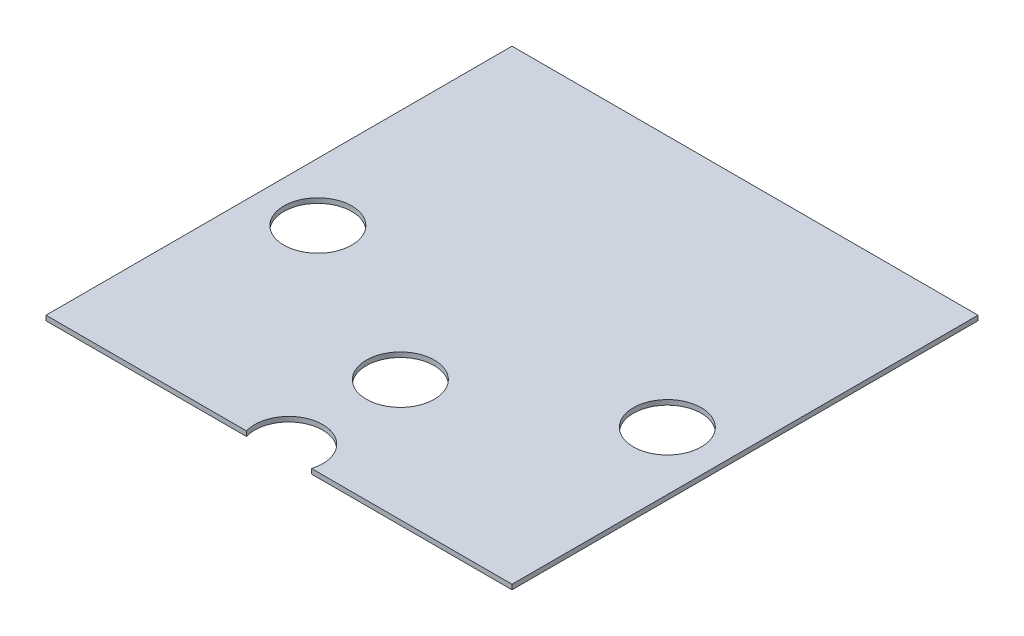
ISO-10303-21;
HEADER;
FILE_DESCRIPTION(('STEP AP214'),'2;1');
FILE_NAME('part.step','',(''),(''),'','','');
FILE_SCHEMA(('AUTOMOTIVE_DESIGN { 1 0 10303 214 1 1 1 1 }'));
ENDSEC;
DATA;
#1=APPLICATION_CONTEXT('core data for automotive mechanical design processes');
#2=APPLICATION_PROTOCOL_DEFINITION('international standard','automotive_design',2000,#1);
#3=PRODUCT_CONTEXT('',#1,'mechanical');
#4=PRODUCT('Part','Part','',(#3));
#5=PRODUCT_RELATED_PRODUCT_CATEGORY('part','',(#4));
#6=PRODUCT_DEFINITION_FORMATION('','',#4);
#7=PRODUCT_DEFINITION_CONTEXT('part definition',#1,'design');
#8=PRODUCT_DEFINITION('design','',#6,#7);
#9=PRODUCT_DEFINITION_SHAPE('','',#8);
#10=(LENGTH_UNIT() NAMED_UNIT(*) SI_UNIT(.MILLI.,.METRE.));
#11=(NAMED_UNIT(*) PLANE_ANGLE_UNIT() SI_UNIT($,.RADIAN.));
#12=(NAMED_UNIT(*) SI_UNIT($,.STERADIAN.) SOLID_ANGLE_UNIT());
#13=UNCERTAINTY_MEASURE_WITH_UNIT(LENGTH_MEASURE(1.E-05),#10,'distance_accuracy_value','');
#14=(GEOMETRIC_REPRESENTATION_CONTEXT(3) GLOBAL_UNCERTAINTY_ASSIGNED_CONTEXT((#13)) GLOBAL_UNIT_ASSIGNED_CONTEXT((#10,
#11,#12)) REPRESENTATION_CONTEXT('',''));
#15=CARTESIAN_POINT('',(0.,0.,0.));
#16=DIRECTION('',(0.,0.,1.));
#17=DIRECTION('',(1.,0.,0.));
#18=AXIS2_PLACEMENT_3D('',#15,#16,#17);
#19=CARTESIAN_POINT('',(-387.157575757576,6.35,327.890909090909));
#20=DIRECTION('',(0.,0.,-1.));
#21=DIRECTION('',(-1.,0.,0.));
#22=AXIS2_PLACEMENT_3D('',#19,#20,#21);
#23=PLANE('',#22);
#24=DIRECTION('',(1.,0.,0.));
#25=VECTOR('',#24,1.);
#26=CARTESIAN_POINT('',(-387.157575757576,0.,327.890909090909));
#27=LINE('',#26,#25);
#28=CARTESIAN_POINT('',(-387.157575757576,0.,327.890909090909));
#29=VERTEX_POINT('',#28);
#30=CARTESIAN_POINT('',(-124.954670728947,0.,327.890909090909));
#31=VERTEX_POINT('',#30);
#32=EDGE_CURVE('E133',#29,#31,#27,.T.);
#33=ORIENTED_EDGE('',*,*,#32,.T.);
#34=DIRECTION('',(0.,1.,0.));
#35=VECTOR('',#34,1.);
#36=CARTESIAN_POINT('',(-124.954670728947,-95.25,327.890909090909));
#37=LINE('',#36,#35);
#38=CARTESIAN_POINT('',(-124.954670728947,6.35,327.890909090909));
#39=VERTEX_POINT('',#38);
#40=EDGE_CURVE('E55',#31,#39,#37,.T.);
#41=ORIENTED_EDGE('',*,*,#40,.T.);
#42=DIRECTION('',(1.,0.,0.));
#43=VECTOR('',#42,1.);
#44=CARTESIAN_POINT('',(-387.157575757576,6.35,327.890909090909));
#45=LINE('',#44,#43);
#46=CARTESIAN_POINT('',(-387.157575757576,6.35,327.890909090909));
#47=VERTEX_POINT('',#46);
#48=EDGE_CURVE('E91',#47,#39,#45,.T.);
#49=ORIENTED_EDGE('',*,*,#48,.F.);
#50=DIRECTION('',(0.,-1.,0.));
#51=VECTOR('',#50,1.);
#52=CARTESIAN_POINT('',(-387.157575757576,6.35,327.890909090909));
#53=LINE('',#52,#51);
#54=EDGE_CURVE('E47',#47,#29,#53,.T.);
#55=ORIENTED_EDGE('',*,*,#54,.T.);
#56=EDGE_LOOP('',(#33,#41,#49,#55));
#57=FACE_BOUND('',#56,.T.);
#58=ADVANCED_FACE('F38',(#57),#23,.F.);
#59=CARTESIAN_POINT('',(-387.157575757576,6.35,-281.709090909091));
#60=DIRECTION('',(1.,0.,0.));
#61=DIRECTION('',(0.,0.,-1.));
#62=AXIS2_PLACEMENT_3D('',#59,#60,#61);
#63=PLANE('',#62);
#64=DIRECTION('',(0.,0.,1.));
#65=VECTOR('',#64,1.);
#66=CARTESIAN_POINT('',(-387.157575757576,0.,-281.709090909091));
#67=LINE('',#66,#65);
#68=CARTESIAN_POINT('',(-387.157575757576,0.,-281.709090909091));
#69=VERTEX_POINT('',#68);
#70=EDGE_CURVE('E129',#69,#29,#67,.T.);
#71=ORIENTED_EDGE('',*,*,#70,.T.);
#72=ORIENTED_EDGE('',*,*,#54,.F.);
#73=DIRECTION('',(0.,0.,1.));
#74=VECTOR('',#73,1.);
#75=CARTESIAN_POINT('',(-387.157575757576,6.35,-281.709090909091));
#76=LINE('',#75,#74);
#77=CARTESIAN_POINT('',(-387.157575757576,6.35,-281.709090909091));
#78=VERTEX_POINT('',#77);
#79=EDGE_CURVE('E120',#78,#47,#76,.T.);
#80=ORIENTED_EDGE('',*,*,#79,.F.);
#81=DIRECTION('',(0.,-1.,0.));
#82=VECTOR('',#81,1.);
#83=CARTESIAN_POINT('',(-387.157575757576,6.35,-281.709090909091));
#84=LINE('',#83,#82);
#85=EDGE_CURVE('E128',#78,#69,#84,.T.);
#86=ORIENTED_EDGE('',*,*,#85,.T.);
#87=EDGE_LOOP('',(#71,#72,#80,#86));
#88=FACE_BOUND('',#87,.T.);
#89=ADVANCED_FACE('F40',(#88),#63,.F.);
#90=CARTESIAN_POINT('',(-39.7604807862044,6.35,327.890909090909));
#91=VERTEX_POINT('',#90);
#92=CARTESIAN_POINT('',(222.442424242424,6.35,327.890909090909));
#93=VERTEX_POINT('',#92);
#94=EDGE_CURVE('E111',#91,#93,#45,.T.);
#95=ORIENTED_EDGE('',*,*,#94,.F.);
#96=DIRECTION('',(0.,1.,0.));
#97=VECTOR('',#96,1.);
#98=CARTESIAN_POINT('',(-39.7604807862044,-95.25,327.890909090909));
#99=LINE('',#98,#97);
#100=CARTESIAN_POINT('',(-39.7604807862044,0.,327.890909090909));
#101=VERTEX_POINT('',#100);
#102=EDGE_CURVE('E100',#91,#101,#99,.F.);
#103=ORIENTED_EDGE('',*,*,#102,.T.);
#104=CARTESIAN_POINT('',(222.442424242424,0.,327.890909090909));
#105=VERTEX_POINT('',#104);
#106=EDGE_CURVE('E132',#101,#105,#27,.T.);
#107=ORIENTED_EDGE('',*,*,#106,.T.);
#108=DIRECTION('',(0.,-1.,0.));
#109=VECTOR('',#108,1.);
#110=CARTESIAN_POINT('',(222.442424242424,6.35,327.890909090909));
#111=LINE('',#110,#109);
#112=EDGE_CURVE('E118',#93,#105,#111,.T.);
#113=ORIENTED_EDGE('',*,*,#112,.F.);
#114=EDGE_LOOP('',(#95,#103,#107,#113));
#115=FACE_BOUND('',#114,.T.);
#116=ADVANCED_FACE('F116',(#115),#23,.F.);
#117=CARTESIAN_POINT('',(222.442424242424,6.35,-281.709090909091));
#118=DIRECTION('',(-1.,0.,0.));
#119=DIRECTION('',(0.,0.,1.));
#120=AXIS2_PLACEMENT_3D('',#117,#118,#119);
#121=PLANE('',#120);
#122=DIRECTION('',(0.,0.,-1.));
#123=VECTOR('',#122,1.);
#124=CARTESIAN_POINT('',(222.442424242424,0.,-281.709090909091));
#125=LINE('',#124,#123);
#126=CARTESIAN_POINT('',(222.442424242424,0.,-281.709090909091));
#127=VERTEX_POINT('',#126);
#128=EDGE_CURVE('E136',#105,#127,#125,.T.);
#129=ORIENTED_EDGE('',*,*,#128,.T.);
#130=DIRECTION('',(0.,-1.,0.));
#131=VECTOR('',#130,1.);
#132=CARTESIAN_POINT('',(222.442424242424,6.35,-281.709090909091));
#133=LINE('',#132,#131);
#134=CARTESIAN_POINT('',(222.442424242424,6.35,-281.709090909091));
#135=VERTEX_POINT('',#134);
#136=EDGE_CURVE('E140',#135,#127,#133,.T.);
#137=ORIENTED_EDGE('',*,*,#136,.F.);
#138=DIRECTION('',(0.,0.,-1.));
#139=VECTOR('',#138,1.);
#140=CARTESIAN_POINT('',(222.442424242424,6.35,-281.709090909091));
#141=LINE('',#140,#139);
#142=EDGE_CURVE('E122',#93,#135,#141,.T.);
#143=ORIENTED_EDGE('',*,*,#142,.F.);
#144=ORIENTED_EDGE('',*,*,#112,.T.);
#145=EDGE_LOOP('',(#129,#137,#143,#144));
#146=FACE_BOUND('',#145,.T.);
#147=ADVANCED_FACE('F175',(#146),#121,.F.);
#148=CARTESIAN_POINT('',(-387.157575757576,6.35,-281.709090909091));
#149=DIRECTION('',(0.,0.,1.));
#150=DIRECTION('',(1.,0.,0.));
#151=AXIS2_PLACEMENT_3D('',#148,#149,#150);
#152=PLANE('',#151);
#153=DIRECTION('',(-1.,0.,0.));
#154=VECTOR('',#153,1.);
#155=CARTESIAN_POINT('',(-387.157575757576,0.,-281.709090909091));
#156=LINE('',#155,#154);
#157=EDGE_CURVE('E84',#127,#69,#156,.T.);
#158=ORIENTED_EDGE('',*,*,#157,.T.);
#159=ORIENTED_EDGE('',*,*,#85,.F.);
#160=DIRECTION('',(-1.,0.,0.));
#161=VECTOR('',#160,1.);
#162=CARTESIAN_POINT('',(-387.157575757576,6.35,-281.709090909091));
#163=LINE('',#162,#161);
#164=EDGE_CURVE('E63',#135,#78,#163,.T.);
#165=ORIENTED_EDGE('',*,*,#164,.F.);
#166=ORIENTED_EDGE('',*,*,#136,.T.);
#167=EDGE_LOOP('',(#158,#159,#165,#166));
#168=FACE_BOUND('',#167,.T.);
#169=ADVANCED_FACE('F164',(#168),#152,.F.);
#170=CARTESIAN_POINT('',(0.,6.35,0.));
#171=DIRECTION('',(0.,1.,0.));
#172=DIRECTION('',(0.,0.,1.));
#173=AXIS2_PLACEMENT_3D('',#170,#171,#172);
#174=PLANE('',#173);
#175=CARTESIAN_POINT('',(146.242424242424,6.35,48.4909090909089));
#176=DIRECTION('',(0.,1.,0.));
#177=DIRECTION('',(0.,0.,1.));
#178=AXIS2_PLACEMENT_3D('',#175,#176,#177);
#179=CIRCLE('',#178,44.4500000000002);
#180=CARTESIAN_POINT('',(146.242424242424,6.35,92.9409090909091));
#181=VERTEX_POINT('',#180);
#182=EDGE_CURVE('E153',#181,#181,#179,.T.);
#183=ORIENTED_EDGE('',*,*,#182,.F.);
#184=EDGE_LOOP('',(#183));
#185=FACE_BOUND('',#184,.T.);
#186=CARTESIAN_POINT('',(-310.957575757576,6.35,48.4909090909089));
#187=DIRECTION('',(0.,1.,0.));
#188=DIRECTION('',(0.,0.,1.));
#189=AXIS2_PLACEMENT_3D('',#186,#187,#188);
#190=CIRCLE('',#189,44.4500000000003);
#191=CARTESIAN_POINT('',(-310.957575757576,6.35,92.9409090909092));
#192=VERTEX_POINT('',#191);
#193=EDGE_CURVE('E114',#192,#192,#190,.T.);
#194=ORIENTED_EDGE('',*,*,#193,.F.);
#195=EDGE_LOOP('',(#194));
#196=FACE_BOUND('',#195,.T.);
#197=CARTESIAN_POINT('',(-82.3575757575757,6.35,315.190909090909));
#198=DIRECTION('',(0.,1.,0.));
#199=DIRECTION('',(0.,0.,1.));
#200=AXIS2_PLACEMENT_3D('',#197,#198,#199);
#201=CIRCLE('',#200,44.4500000000004);
#202=EDGE_CURVE('E103',#91,#39,#201,.T.);
#203=ORIENTED_EDGE('',*,*,#202,.F.);
#204=ORIENTED_EDGE('',*,*,#94,.T.);
#205=ORIENTED_EDGE('',*,*,#142,.T.);
#206=ORIENTED_EDGE('',*,*,#164,.T.);
#207=ORIENTED_EDGE('',*,*,#79,.T.);
#208=ORIENTED_EDGE('',*,*,#48,.T.);
#209=EDGE_LOOP('',(#203,#204,#205,#206,#207,#208));
#210=FACE_BOUND('',#209,.T.);
#211=CARTESIAN_POINT('',(-82.3575757575757,6.35,169.140909090909));
#212=DIRECTION('',(0.,1.,0.));
#213=DIRECTION('',(0.,0.,1.));
#214=AXIS2_PLACEMENT_3D('',#211,#212,#213);
#215=CIRCLE('',#214,44.4500000000004);
#216=CARTESIAN_POINT('',(-82.3575757575757,6.35,213.590909090909));
#217=VERTEX_POINT('',#216);
#218=EDGE_CURVE('E113',#217,#217,#215,.T.);
#219=ORIENTED_EDGE('',*,*,#218,.F.);
#220=EDGE_LOOP('',(#219));
#221=FACE_BOUND('',#220,.T.);
#222=ADVANCED_FACE('F109',(#185,#196,#210,#221),#174,.T.);
#223=CARTESIAN_POINT('',(0.,0.,0.));
#224=DIRECTION('',(0.,1.,0.));
#225=DIRECTION('',(0.,0.,1.));
#226=AXIS2_PLACEMENT_3D('',#223,#224,#225);
#227=PLANE('',#226);
#228=CARTESIAN_POINT('',(146.242424242424,0.,48.4909090909089));
#229=DIRECTION('',(0.,1.,0.));
#230=DIRECTION('',(0.,0.,1.));
#231=AXIS2_PLACEMENT_3D('',#228,#229,#230);
#232=CIRCLE('',#231,44.4500000000002);
#233=CARTESIAN_POINT('',(146.242424242424,0.,92.9409090909091));
#234=VERTEX_POINT('',#233);
#235=EDGE_CURVE('E42',#234,#234,#232,.T.);
#236=ORIENTED_EDGE('',*,*,#235,.T.);
#237=EDGE_LOOP('',(#236));
#238=FACE_BOUND('',#237,.T.);
#239=CARTESIAN_POINT('',(-310.957575757576,0.,48.4909090909089));
#240=DIRECTION('',(0.,1.,0.));
#241=DIRECTION('',(0.,0.,1.));
#242=AXIS2_PLACEMENT_3D('',#239,#240,#241);
#243=CIRCLE('',#242,44.4500000000003);
#244=CARTESIAN_POINT('',(-310.957575757576,0.,92.9409090909092));
#245=VERTEX_POINT('',#244);
#246=EDGE_CURVE('E145',#245,#245,#243,.T.);
#247=ORIENTED_EDGE('',*,*,#246,.T.);
#248=EDGE_LOOP('',(#247));
#249=FACE_BOUND('',#248,.T.);
#250=CARTESIAN_POINT('',(-82.3575757575757,0.,169.140909090909));
#251=DIRECTION('',(0.,1.,0.));
#252=DIRECTION('',(0.,0.,1.));
#253=AXIS2_PLACEMENT_3D('',#250,#251,#252);
#254=CIRCLE('',#253,44.4500000000004);
#255=CARTESIAN_POINT('',(-82.3575757575757,0.,213.590909090909));
#256=VERTEX_POINT('',#255);
#257=EDGE_CURVE('E107',#256,#256,#254,.T.);
#258=ORIENTED_EDGE('',*,*,#257,.T.);
#259=EDGE_LOOP('',(#258));
#260=FACE_BOUND('',#259,.T.);
#261=ORIENTED_EDGE('',*,*,#106,.F.);
#262=CARTESIAN_POINT('',(-82.3575757575757,0.,315.190909090909));
#263=DIRECTION('',(0.,1.,0.));
#264=DIRECTION('',(0.,0.,1.));
#265=AXIS2_PLACEMENT_3D('',#262,#263,#264);
#266=CIRCLE('',#265,44.4500000000004);
#267=EDGE_CURVE('E11',#101,#31,#266,.T.);
#268=ORIENTED_EDGE('',*,*,#267,.T.);
#269=ORIENTED_EDGE('',*,*,#32,.F.);
#270=ORIENTED_EDGE('',*,*,#70,.F.);
#271=ORIENTED_EDGE('',*,*,#157,.F.);
#272=ORIENTED_EDGE('',*,*,#128,.F.);
#273=EDGE_LOOP('',(#261,#268,#269,#270,#271,#272));
#274=FACE_BOUND('',#273,.T.);
#275=ADVANCED_FACE('F163',(#238,#249,#260,#274),#227,.F.);
#276=CARTESIAN_POINT('',(-82.3575757575757,-95.25,169.140909090909));
#277=DIRECTION('',(0.,1.,0.));
#278=DIRECTION('',(0.,0.,1.));
#279=AXIS2_PLACEMENT_3D('',#276,#277,#278);
#280=CYLINDRICAL_SURFACE('',#279,44.4500000000004);
#281=ORIENTED_EDGE('',*,*,#218,.T.);
#282=EDGE_LOOP('',(#281));
#283=FACE_BOUND('',#282,.T.);
#284=ORIENTED_EDGE('',*,*,#257,.F.);
#285=EDGE_LOOP('',(#284));
#286=FACE_BOUND('',#285,.T.);
#287=ADVANCED_FACE('F171',(#283,#286),#280,.F.);
#288=CARTESIAN_POINT('',(-82.3575757575757,-95.25,315.190909090909));
#289=DIRECTION('',(0.,1.,0.));
#290=DIRECTION('',(0.,0.,1.));
#291=AXIS2_PLACEMENT_3D('',#288,#289,#290);
#292=CYLINDRICAL_SURFACE('',#291,44.4500000000004);
#293=ORIENTED_EDGE('',*,*,#267,.F.);
#294=ORIENTED_EDGE('',*,*,#102,.F.);
#295=ORIENTED_EDGE('',*,*,#202,.T.);
#296=ORIENTED_EDGE('',*,*,#40,.F.);
#297=EDGE_LOOP('',(#293,#294,#295,#296));
#298=FACE_BOUND('',#297,.T.);
#299=ADVANCED_FACE('F102',(#298),#292,.F.);
#300=CARTESIAN_POINT('',(-310.957575757576,-95.25,48.4909090909089));
#301=DIRECTION('',(0.,1.,0.));
#302=DIRECTION('',(0.,0.,1.));
#303=AXIS2_PLACEMENT_3D('',#300,#301,#302);
#304=CYLINDRICAL_SURFACE('',#303,44.4500000000003);
#305=ORIENTED_EDGE('',*,*,#193,.T.);
#306=EDGE_LOOP('',(#305));
#307=FACE_BOUND('',#306,.T.);
#308=ORIENTED_EDGE('',*,*,#246,.F.);
#309=EDGE_LOOP('',(#308));
#310=FACE_BOUND('',#309,.T.);
#311=ADVANCED_FACE('F159',(#307,#310),#304,.F.);
#312=CARTESIAN_POINT('',(146.242424242424,-95.25,48.4909090909089));
#313=DIRECTION('',(0.,1.,0.));
#314=DIRECTION('',(0.,0.,1.));
#315=AXIS2_PLACEMENT_3D('',#312,#313,#314);
#316=CYLINDRICAL_SURFACE('',#315,44.4500000000002);
#317=ORIENTED_EDGE('',*,*,#182,.T.);
#318=EDGE_LOOP('',(#317));
#319=FACE_BOUND('',#318,.T.);
#320=ORIENTED_EDGE('',*,*,#235,.F.);
#321=EDGE_LOOP('',(#320));
#322=FACE_BOUND('',#321,.T.);
#323=ADVANCED_FACE('F236',(#319,#322),#316,.F.);
#324=CLOSED_SHELL('',(#58,#89,#116,#147,#169,#222,#275,#287,#299,#311,#323));
#325=MANIFOLD_SOLID_BREP('B2',#324);
#326=ADVANCED_BREP_SHAPE_REPRESENTATION('',(#18,#325),#14);
#327=SHAPE_DEFINITION_REPRESENTATION(#9,#326);
ENDSEC;
END-ISO-10303-21;
